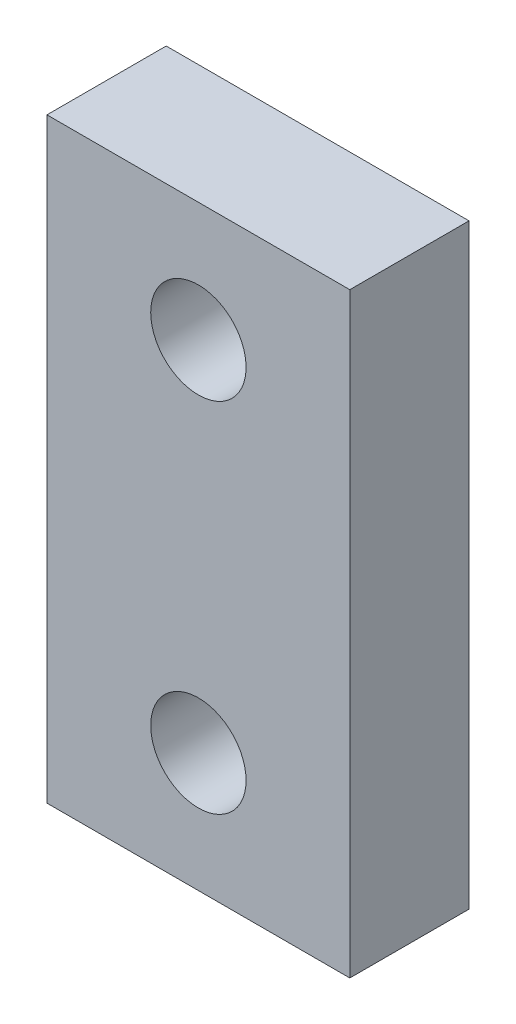
ISO-10303-21;
HEADER;
FILE_DESCRIPTION(('STEP AP214'),'2;1');
FILE_NAME('part.step','',(''),(''),'','','');
FILE_SCHEMA(('AUTOMOTIVE_DESIGN { 1 0 10303 214 1 1 1 1 }'));
ENDSEC;
DATA;
#1=APPLICATION_CONTEXT('core data for automotive mechanical design processes');
#2=APPLICATION_PROTOCOL_DEFINITION('international standard','automotive_design',2000,#1);
#3=PRODUCT_CONTEXT('',#1,'mechanical');
#4=PRODUCT('Part','Part','',(#3));
#5=PRODUCT_RELATED_PRODUCT_CATEGORY('part','',(#4));
#6=PRODUCT_DEFINITION_FORMATION('','',#4);
#7=PRODUCT_DEFINITION_CONTEXT('part definition',#1,'design');
#8=PRODUCT_DEFINITION('design','',#6,#7);
#9=PRODUCT_DEFINITION_SHAPE('','',#8);
#10=(LENGTH_UNIT() NAMED_UNIT(*) SI_UNIT(.MILLI.,.METRE.));
#11=(NAMED_UNIT(*) PLANE_ANGLE_UNIT() SI_UNIT($,.RADIAN.));
#12=(NAMED_UNIT(*) SI_UNIT($,.STERADIAN.) SOLID_ANGLE_UNIT());
#13=UNCERTAINTY_MEASURE_WITH_UNIT(LENGTH_MEASURE(1.E-05),#10,'distance_accuracy_value','');
#14=(GEOMETRIC_REPRESENTATION_CONTEXT(3) GLOBAL_UNCERTAINTY_ASSIGNED_CONTEXT((#13)) GLOBAL_UNIT_ASSIGNED_CONTEXT((#10,
#11,#12)) REPRESENTATION_CONTEXT('',''));
#15=CARTESIAN_POINT('',(0.,0.,0.));
#16=DIRECTION('',(0.,0.,1.));
#17=DIRECTION('',(1.,0.,0.));
#18=AXIS2_PLACEMENT_3D('',#15,#16,#17);
#19=CARTESIAN_POINT('',(0.,0.,5.));
#20=DIRECTION('',(0.,0.,-1.));
#21=DIRECTION('',(-1.,0.,0.));
#22=AXIS2_PLACEMENT_3D('',#19,#20,#21);
#23=PLANE('',#22);
#24=DIRECTION('',(0.,1.,0.));
#25=VECTOR('',#24,1.);
#26=CARTESIAN_POINT('',(6.35,-12.5,5.));
#27=LINE('',#26,#25);
#28=CARTESIAN_POINT('',(6.35,-12.5,5.));
#29=VERTEX_POINT('',#28);
#30=CARTESIAN_POINT('',(6.35,12.5,5.));
#31=VERTEX_POINT('',#30);
#32=EDGE_CURVE('E87',#29,#31,#27,.T.);
#33=ORIENTED_EDGE('',*,*,#32,.T.);
#34=DIRECTION('',(-1.,0.,0.));
#35=VECTOR('',#34,1.);
#36=CARTESIAN_POINT('',(-6.35,12.5,5.));
#37=LINE('',#36,#35);
#38=CARTESIAN_POINT('',(-6.35,12.5,5.));
#39=VERTEX_POINT('',#38);
#40=EDGE_CURVE('E82',#31,#39,#37,.T.);
#41=ORIENTED_EDGE('',*,*,#40,.T.);
#42=DIRECTION('',(0.,-1.,0.));
#43=VECTOR('',#42,1.);
#44=CARTESIAN_POINT('',(-6.35,-12.5,5.));
#45=LINE('',#44,#43);
#46=CARTESIAN_POINT('',(-6.35,-12.5,5.));
#47=VERTEX_POINT('',#46);
#48=EDGE_CURVE('E85',#39,#47,#45,.T.);
#49=ORIENTED_EDGE('',*,*,#48,.T.);
#50=DIRECTION('',(1.,0.,0.));
#51=VECTOR('',#50,1.);
#52=CARTESIAN_POINT('',(-6.35,-12.5,5.));
#53=LINE('',#52,#51);
#54=EDGE_CURVE('E52',#47,#29,#53,.T.);
#55=ORIENTED_EDGE('',*,*,#54,.T.);
#56=EDGE_LOOP('',(#33,#41,#49,#55));
#57=FACE_BOUND('',#56,.T.);
#58=CARTESIAN_POINT('',(0.,-7.5,5.));
#59=DIRECTION('',(0.,0.,1.));
#60=DIRECTION('',(1.,0.,0.));
#61=AXIS2_PLACEMENT_3D('',#58,#59,#60);
#62=CIRCLE('',#61,2.);
#63=CARTESIAN_POINT('',(2.,-7.5,5.));
#64=VERTEX_POINT('',#63);
#65=EDGE_CURVE('E102',#64,#64,#62,.T.);
#66=ORIENTED_EDGE('',*,*,#65,.F.);
#67=EDGE_LOOP('',(#66));
#68=FACE_BOUND('',#67,.T.);
#69=CARTESIAN_POINT('',(0.,7.5,5.));
#70=DIRECTION('',(0.,0.,1.));
#71=DIRECTION('',(-1.,0.,0.));
#72=AXIS2_PLACEMENT_3D('',#69,#70,#71);
#73=CIRCLE('',#72,2.);
#74=CARTESIAN_POINT('',(-2.,7.5,5.));
#75=VERTEX_POINT('',#74);
#76=EDGE_CURVE('E117',#75,#75,#73,.T.);
#77=ORIENTED_EDGE('',*,*,#76,.F.);
#78=EDGE_LOOP('',(#77));
#79=FACE_BOUND('',#78,.T.);
#80=ADVANCED_FACE('F35',(#57,#68,#79),#23,.F.);
#81=CARTESIAN_POINT('',(0.,0.,0.));
#82=DIRECTION('',(0.,0.,-1.));
#83=DIRECTION('',(-1.,0.,0.));
#84=AXIS2_PLACEMENT_3D('',#81,#82,#83);
#85=PLANE('',#84);
#86=CARTESIAN_POINT('',(0.,-7.5,0.));
#87=DIRECTION('',(0.,0.,1.));
#88=DIRECTION('',(1.,0.,0.));
#89=AXIS2_PLACEMENT_3D('',#86,#87,#88);
#90=CIRCLE('',#89,2.);
#91=CARTESIAN_POINT('',(2.,-7.5,0.));
#92=VERTEX_POINT('',#91);
#93=EDGE_CURVE('E114',#92,#92,#90,.T.);
#94=ORIENTED_EDGE('',*,*,#93,.T.);
#95=EDGE_LOOP('',(#94));
#96=FACE_BOUND('',#95,.T.);
#97=DIRECTION('',(0.,1.,0.));
#98=VECTOR('',#97,1.);
#99=CARTESIAN_POINT('',(6.35,-12.5,0.));
#100=LINE('',#99,#98);
#101=CARTESIAN_POINT('',(6.35,-12.5,0.));
#102=VERTEX_POINT('',#101);
#103=CARTESIAN_POINT('',(6.35,12.5,0.));
#104=VERTEX_POINT('',#103);
#105=EDGE_CURVE('E99',#102,#104,#100,.T.);
#106=ORIENTED_EDGE('',*,*,#105,.F.);
#107=DIRECTION('',(1.,0.,0.));
#108=VECTOR('',#107,1.);
#109=CARTESIAN_POINT('',(-6.35,-12.5,0.));
#110=LINE('',#109,#108);
#111=CARTESIAN_POINT('',(-6.35,-12.5,0.));
#112=VERTEX_POINT('',#111);
#113=EDGE_CURVE('E75',#112,#102,#110,.T.);
#114=ORIENTED_EDGE('',*,*,#113,.F.);
#115=DIRECTION('',(0.,-1.,0.));
#116=VECTOR('',#115,1.);
#117=CARTESIAN_POINT('',(-6.35,-12.5,0.));
#118=LINE('',#117,#116);
#119=CARTESIAN_POINT('',(-6.35,12.5,0.));
#120=VERTEX_POINT('',#119);
#121=EDGE_CURVE('E69',#120,#112,#118,.T.);
#122=ORIENTED_EDGE('',*,*,#121,.F.);
#123=DIRECTION('',(-1.,0.,0.));
#124=VECTOR('',#123,1.);
#125=CARTESIAN_POINT('',(-6.35,12.5,0.));
#126=LINE('',#125,#124);
#127=EDGE_CURVE('E91',#104,#120,#126,.T.);
#128=ORIENTED_EDGE('',*,*,#127,.F.);
#129=EDGE_LOOP('',(#106,#114,#122,#128));
#130=FACE_BOUND('',#129,.T.);
#131=CARTESIAN_POINT('',(0.,7.5,0.));
#132=DIRECTION('',(0.,0.,1.));
#133=DIRECTION('',(-1.,0.,0.));
#134=AXIS2_PLACEMENT_3D('',#131,#132,#133);
#135=CIRCLE('',#134,2.);
#136=CARTESIAN_POINT('',(-2.,7.5,0.));
#137=VERTEX_POINT('',#136);
#138=EDGE_CURVE('E120',#137,#137,#135,.T.);
#139=ORIENTED_EDGE('',*,*,#138,.T.);
#140=EDGE_LOOP('',(#139));
#141=FACE_BOUND('',#140,.T.);
#142=ADVANCED_FACE('F110',(#96,#130,#141),#85,.T.);
#143=CARTESIAN_POINT('',(6.35,-12.5,5.));
#144=DIRECTION('',(-1.,0.,0.));
#145=DIRECTION('',(0.,-1.,0.));
#146=AXIS2_PLACEMENT_3D('',#143,#144,#145);
#147=PLANE('',#146);
#148=ORIENTED_EDGE('',*,*,#105,.T.);
#149=DIRECTION('',(0.,0.,-1.));
#150=VECTOR('',#149,1.);
#151=CARTESIAN_POINT('',(6.35,12.5,5.));
#152=LINE('',#151,#150);
#153=EDGE_CURVE('E11',#31,#104,#152,.T.);
#154=ORIENTED_EDGE('',*,*,#153,.F.);
#155=ORIENTED_EDGE('',*,*,#32,.F.);
#156=DIRECTION('',(0.,0.,-1.));
#157=VECTOR('',#156,1.);
#158=CARTESIAN_POINT('',(6.35,-12.5,5.));
#159=LINE('',#158,#157);
#160=EDGE_CURVE('E95',#29,#102,#159,.T.);
#161=ORIENTED_EDGE('',*,*,#160,.T.);
#162=EDGE_LOOP('',(#148,#154,#155,#161));
#163=FACE_BOUND('',#162,.T.);
#164=ADVANCED_FACE('F37',(#163),#147,.F.);
#165=CARTESIAN_POINT('',(-6.35,12.5,5.));
#166=DIRECTION('',(0.,-1.,0.));
#167=DIRECTION('',(1.,0.,0.));
#168=AXIS2_PLACEMENT_3D('',#165,#166,#167);
#169=PLANE('',#168);
#170=ORIENTED_EDGE('',*,*,#127,.T.);
#171=DIRECTION('',(0.,0.,-1.));
#172=VECTOR('',#171,1.);
#173=CARTESIAN_POINT('',(-6.35,12.5,5.));
#174=LINE('',#173,#172);
#175=EDGE_CURVE('E44',#39,#120,#174,.T.);
#176=ORIENTED_EDGE('',*,*,#175,.F.);
#177=ORIENTED_EDGE('',*,*,#40,.F.);
#178=ORIENTED_EDGE('',*,*,#153,.T.);
#179=EDGE_LOOP('',(#170,#176,#177,#178));
#180=FACE_BOUND('',#179,.T.);
#181=ADVANCED_FACE('F90',(#180),#169,.F.);
#182=CARTESIAN_POINT('',(-6.35,-12.5,5.));
#183=DIRECTION('',(1.,0.,0.));
#184=DIRECTION('',(0.,1.,0.));
#185=AXIS2_PLACEMENT_3D('',#182,#183,#184);
#186=PLANE('',#185);
#187=ORIENTED_EDGE('',*,*,#121,.T.);
#188=DIRECTION('',(0.,0.,-1.));
#189=VECTOR('',#188,1.);
#190=CARTESIAN_POINT('',(-6.35,-12.5,5.));
#191=LINE('',#190,#189);
#192=EDGE_CURVE('E92',#47,#112,#191,.T.);
#193=ORIENTED_EDGE('',*,*,#192,.F.);
#194=ORIENTED_EDGE('',*,*,#48,.F.);
#195=ORIENTED_EDGE('',*,*,#175,.T.);
#196=EDGE_LOOP('',(#187,#193,#194,#195));
#197=FACE_BOUND('',#196,.T.);
#198=ADVANCED_FACE('F93',(#197),#186,.F.);
#199=CARTESIAN_POINT('',(-6.35,-12.5,5.));
#200=DIRECTION('',(0.,1.,0.));
#201=DIRECTION('',(-1.,0.,0.));
#202=AXIS2_PLACEMENT_3D('',#199,#200,#201);
#203=PLANE('',#202);
#204=ORIENTED_EDGE('',*,*,#113,.T.);
#205=ORIENTED_EDGE('',*,*,#160,.F.);
#206=ORIENTED_EDGE('',*,*,#54,.F.);
#207=ORIENTED_EDGE('',*,*,#192,.T.);
#208=EDGE_LOOP('',(#204,#205,#206,#207));
#209=FACE_BOUND('',#208,.T.);
#210=ADVANCED_FACE('F107',(#209),#203,.F.);
#211=CARTESIAN_POINT('',(0.,-7.5,5.));
#212=DIRECTION('',(0.,0.,-1.));
#213=DIRECTION('',(-1.,0.,0.));
#214=AXIS2_PLACEMENT_3D('',#211,#212,#213);
#215=CYLINDRICAL_SURFACE('',#214,2.);
#216=ORIENTED_EDGE('',*,*,#65,.T.);
#217=EDGE_LOOP('',(#216));
#218=FACE_BOUND('',#217,.T.);
#219=ORIENTED_EDGE('',*,*,#93,.F.);
#220=EDGE_LOOP('',(#219));
#221=FACE_BOUND('',#220,.T.);
#222=ADVANCED_FACE('F137',(#218,#221),#215,.F.);
#223=CARTESIAN_POINT('',(0.,7.5,5.));
#224=DIRECTION('',(0.,0.,-1.));
#225=DIRECTION('',(-1.,0.,0.));
#226=AXIS2_PLACEMENT_3D('',#223,#224,#225);
#227=CYLINDRICAL_SURFACE('',#226,2.);
#228=ORIENTED_EDGE('',*,*,#76,.T.);
#229=EDGE_LOOP('',(#228));
#230=FACE_BOUND('',#229,.T.);
#231=ORIENTED_EDGE('',*,*,#138,.F.);
#232=EDGE_LOOP('',(#231));
#233=FACE_BOUND('',#232,.T.);
#234=ADVANCED_FACE('F126',(#230,#233),#227,.F.);
#235=CLOSED_SHELL('',(#80,#142,#164,#181,#198,#210,#222,#234));
#236=MANIFOLD_SOLID_BREP('B2',#235);
#237=ADVANCED_BREP_SHAPE_REPRESENTATION('',(#18,#236),#14);
#238=SHAPE_DEFINITION_REPRESENTATION(#9,#237);
ENDSEC;
END-ISO-10303-21;
